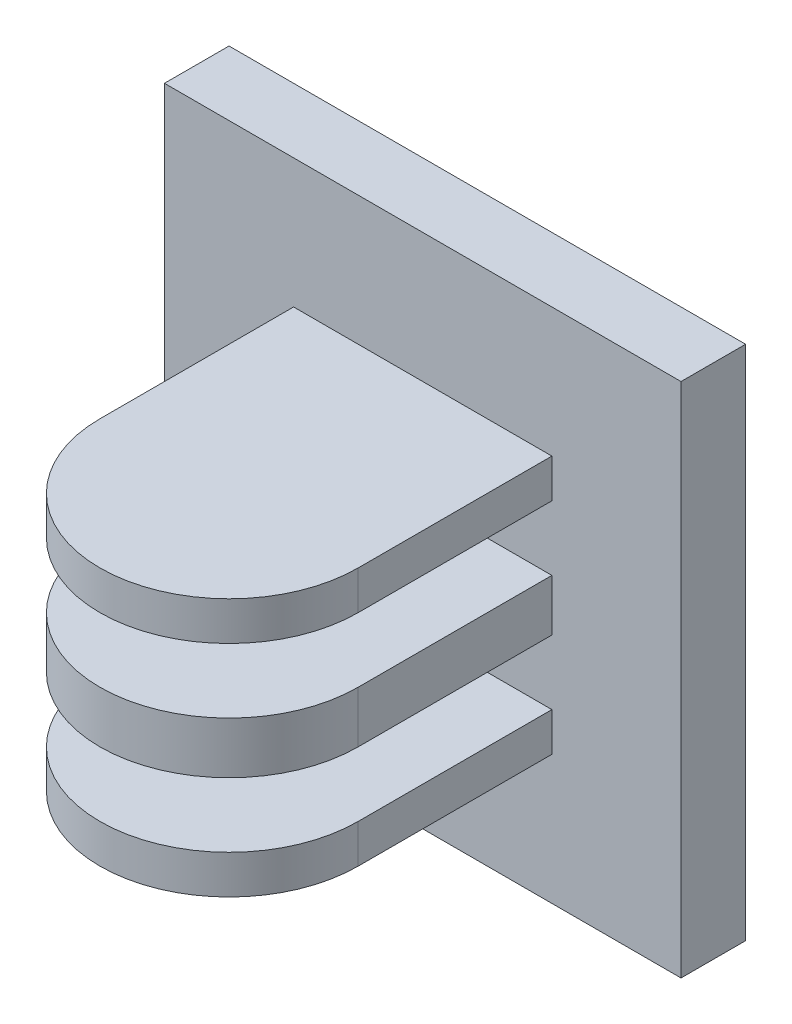
ISO-10303-21;
HEADER;
FILE_DESCRIPTION(('STEP AP214'),'2;1');
FILE_NAME('part.step','',(''),(''),'','','');
FILE_SCHEMA(('AUTOMOTIVE_DESIGN { 1 0 10303 214 1 1 1 1 }'));
ENDSEC;
DATA;
#1=APPLICATION_CONTEXT('core data for automotive mechanical design processes');
#2=APPLICATION_PROTOCOL_DEFINITION('international standard','automotive_design',2000,#1);
#3=PRODUCT_CONTEXT('',#1,'mechanical');
#4=PRODUCT('Part','Part','',(#3));
#5=PRODUCT_RELATED_PRODUCT_CATEGORY('part','',(#4));
#6=PRODUCT_DEFINITION_FORMATION('','',#4);
#7=PRODUCT_DEFINITION_CONTEXT('part definition',#1,'design');
#8=PRODUCT_DEFINITION('design','',#6,#7);
#9=PRODUCT_DEFINITION_SHAPE('','',#8);
#10=(LENGTH_UNIT() NAMED_UNIT(*) SI_UNIT(.MILLI.,.METRE.));
#11=(NAMED_UNIT(*) PLANE_ANGLE_UNIT() SI_UNIT($,.RADIAN.));
#12=(NAMED_UNIT(*) SI_UNIT($,.STERADIAN.) SOLID_ANGLE_UNIT());
#13=UNCERTAINTY_MEASURE_WITH_UNIT(LENGTH_MEASURE(1.E-05),#10,'distance_accuracy_value','');
#14=(GEOMETRIC_REPRESENTATION_CONTEXT(3) GLOBAL_UNCERTAINTY_ASSIGNED_CONTEXT((#13)) GLOBAL_UNIT_ASSIGNED_CONTEXT((#10,
#11,#12)) REPRESENTATION_CONTEXT('',''));
#15=CARTESIAN_POINT('',(0.,0.,0.));
#16=DIRECTION('',(0.,0.,1.));
#17=DIRECTION('',(1.,0.,0.));
#18=AXIS2_PLACEMENT_3D('',#15,#16,#17);
#19=CARTESIAN_POINT('',(10.,-10.,5.));
#20=DIRECTION('',(1.,0.,0.));
#21=DIRECTION('',(0.,0.,-1.));
#22=AXIS2_PLACEMENT_3D('',#19,#20,#21);
#23=PLANE('',#22);
#24=DIRECTION('',(0.,1.,0.));
#25=VECTOR('',#24,1.);
#26=CARTESIAN_POINT('',(10.,-10.,20.));
#27=LINE('',#26,#25);
#28=CARTESIAN_POINT('',(10.,-2.,20.));
#29=VERTEX_POINT('',#28);
#30=CARTESIAN_POINT('',(10.,2.,20.));
#31=VERTEX_POINT('',#30);
#32=EDGE_CURVE('E196',#29,#31,#27,.T.);
#33=ORIENTED_EDGE('',*,*,#32,.F.);
#34=DIRECTION('',(0.,0.,-1.));
#35=VECTOR('',#34,1.);
#36=CARTESIAN_POINT('',(10.,-2.,20.));
#37=LINE('',#36,#35);
#38=CARTESIAN_POINT('',(10.,-2.,5.));
#39=VERTEX_POINT('',#38);
#40=EDGE_CURVE('E305',#29,#39,#37,.T.);
#41=ORIENTED_EDGE('',*,*,#40,.T.);
#42=DIRECTION('',(0.,1.,0.));
#43=VECTOR('',#42,1.);
#44=CARTESIAN_POINT('',(10.,-10.,5.));
#45=LINE('',#44,#43);
#46=CARTESIAN_POINT('',(10.,2.,5.));
#47=VERTEX_POINT('',#46);
#48=EDGE_CURVE('E239',#39,#47,#45,.T.);
#49=ORIENTED_EDGE('',*,*,#48,.T.);
#50=DIRECTION('',(0.,0.,-1.));
#51=VECTOR('',#50,1.);
#52=CARTESIAN_POINT('',(10.,2.,20.));
#53=LINE('',#52,#51);
#54=EDGE_CURVE('E293',#31,#47,#53,.T.);
#55=ORIENTED_EDGE('',*,*,#54,.F.);
#56=EDGE_LOOP('',(#33,#41,#49,#55));
#57=FACE_BOUND('',#56,.T.);
#58=ADVANCED_FACE('F51',(#57),#23,.T.);
#59=CARTESIAN_POINT('',(0.,-10.,20.));
#60=DIRECTION('',(0.,1.,0.));
#61=DIRECTION('',(0.,0.,1.));
#62=AXIS2_PLACEMENT_3D('',#59,#60,#61);
#63=CYLINDRICAL_SURFACE('',#62,10.);
#64=DIRECTION('',(0.,1.,0.));
#65=VECTOR('',#64,1.);
#66=CARTESIAN_POINT('',(-10.,-10.,20.));
#67=LINE('',#66,#65);
#68=CARTESIAN_POINT('',(-10.,-2.,20.));
#69=VERTEX_POINT('',#68);
#70=CARTESIAN_POINT('',(-10.,2.,20.));
#71=VERTEX_POINT('',#70);
#72=EDGE_CURVE('E213',#69,#71,#67,.T.);
#73=ORIENTED_EDGE('',*,*,#72,.F.);
#74=CARTESIAN_POINT('',(0.,-2.,20.));
#75=DIRECTION('',(0.,1.,0.));
#76=DIRECTION('',(0.,0.,-1.));
#77=AXIS2_PLACEMENT_3D('',#74,#75,#76);
#78=CIRCLE('',#77,10.);
#79=EDGE_CURVE('E67',#69,#29,#78,.T.);
#80=ORIENTED_EDGE('',*,*,#79,.T.);
#81=ORIENTED_EDGE('',*,*,#32,.T.);
#82=CARTESIAN_POINT('',(0.,2.,20.));
#83=DIRECTION('',(0.,1.,0.));
#84=DIRECTION('',(0.,0.,-1.));
#85=AXIS2_PLACEMENT_3D('',#82,#83,#84);
#86=CIRCLE('',#85,10.);
#87=EDGE_CURVE('E277',#71,#31,#86,.T.);
#88=ORIENTED_EDGE('',*,*,#87,.F.);
#89=EDGE_LOOP('',(#73,#80,#81,#88));
#90=FACE_BOUND('',#89,.T.);
#91=ADVANCED_FACE('F380',(#90),#63,.T.);
#92=CARTESIAN_POINT('',(-10.,-10.,5.));
#93=DIRECTION('',(-1.,0.,0.));
#94=DIRECTION('',(0.,0.,1.));
#95=AXIS2_PLACEMENT_3D('',#92,#93,#94);
#96=PLANE('',#95);
#97=DIRECTION('',(0.,1.,0.));
#98=VECTOR('',#97,1.);
#99=CARTESIAN_POINT('',(-10.,-10.,5.));
#100=LINE('',#99,#98);
#101=CARTESIAN_POINT('',(-10.,-2.,5.));
#102=VERTEX_POINT('',#101);
#103=CARTESIAN_POINT('',(-10.,2.,5.));
#104=VERTEX_POINT('',#103);
#105=EDGE_CURVE('E227',#102,#104,#100,.T.);
#106=ORIENTED_EDGE('',*,*,#105,.F.);
#107=DIRECTION('',(0.,0.,1.));
#108=VECTOR('',#107,1.);
#109=CARTESIAN_POINT('',(-10.,-2.,5.));
#110=LINE('',#109,#108);
#111=EDGE_CURVE('E178',#102,#69,#110,.T.);
#112=ORIENTED_EDGE('',*,*,#111,.T.);
#113=ORIENTED_EDGE('',*,*,#72,.T.);
#114=DIRECTION('',(0.,0.,1.));
#115=VECTOR('',#114,1.);
#116=CARTESIAN_POINT('',(-10.,2.,5.));
#117=LINE('',#116,#115);
#118=EDGE_CURVE('E260',#104,#71,#117,.T.);
#119=ORIENTED_EDGE('',*,*,#118,.F.);
#120=EDGE_LOOP('',(#106,#112,#113,#119));
#121=FACE_BOUND('',#120,.T.);
#122=ADVANCED_FACE('F387',(#121),#96,.T.);
#123=CARTESIAN_POINT('',(10.,7.,20.));
#124=VERTEX_POINT('',#123);
#125=CARTESIAN_POINT('',(10.,10.,20.));
#126=VERTEX_POINT('',#125);
#127=EDGE_CURVE('E198',#124,#126,#27,.T.);
#128=ORIENTED_EDGE('',*,*,#127,.F.);
#129=DIRECTION('',(0.,0.,-1.));
#130=VECTOR('',#129,1.);
#131=CARTESIAN_POINT('',(10.,7.,20.));
#132=LINE('',#131,#130);
#133=CARTESIAN_POINT('',(10.,7.,5.));
#134=VERTEX_POINT('',#133);
#135=EDGE_CURVE('E281',#124,#134,#132,.T.);
#136=ORIENTED_EDGE('',*,*,#135,.T.);
#137=CARTESIAN_POINT('',(10.,10.,5.));
#138=VERTEX_POINT('',#137);
#139=EDGE_CURVE('E240',#134,#138,#45,.T.);
#140=ORIENTED_EDGE('',*,*,#139,.T.);
#141=DIRECTION('',(0.,0.,-1.));
#142=VECTOR('',#141,1.);
#143=CARTESIAN_POINT('',(10.,10.,5.));
#144=LINE('',#143,#142);
#145=EDGE_CURVE('E256',#126,#138,#144,.T.);
#146=ORIENTED_EDGE('',*,*,#145,.F.);
#147=EDGE_LOOP('',(#128,#136,#140,#146));
#148=FACE_BOUND('',#147,.T.);
#149=ADVANCED_FACE('F383',(#148),#23,.T.);
#150=CARTESIAN_POINT('',(-10.,7.,20.));
#151=VERTEX_POINT('',#150);
#152=CARTESIAN_POINT('',(-10.,10.,20.));
#153=VERTEX_POINT('',#152);
#154=EDGE_CURVE('E214',#151,#153,#67,.T.);
#155=ORIENTED_EDGE('',*,*,#154,.F.);
#156=CARTESIAN_POINT('',(0.,7.,20.));
#157=DIRECTION('',(0.,1.,0.));
#158=DIRECTION('',(0.,0.,-1.));
#159=AXIS2_PLACEMENT_3D('',#156,#157,#158);
#160=CIRCLE('',#159,10.);
#161=EDGE_CURVE('E75',#151,#124,#160,.T.);
#162=ORIENTED_EDGE('',*,*,#161,.T.);
#163=ORIENTED_EDGE('',*,*,#127,.T.);
#164=CARTESIAN_POINT('',(0.,10.,20.));
#165=DIRECTION('',(0.,1.,0.));
#166=DIRECTION('',(0.,0.,1.));
#167=AXIS2_PLACEMENT_3D('',#164,#165,#166);
#168=CIRCLE('',#167,10.);
#169=EDGE_CURVE('E265',#153,#126,#168,.T.);
#170=ORIENTED_EDGE('',*,*,#169,.F.);
#171=EDGE_LOOP('',(#155,#162,#163,#170));
#172=FACE_BOUND('',#171,.T.);
#173=ADVANCED_FACE('F390',(#172),#63,.T.);
#174=CARTESIAN_POINT('',(-10.,7.,5.));
#175=VERTEX_POINT('',#174);
#176=CARTESIAN_POINT('',(-10.,10.,5.));
#177=VERTEX_POINT('',#176);
#178=EDGE_CURVE('E228',#175,#177,#100,.T.);
#179=ORIENTED_EDGE('',*,*,#178,.F.);
#180=DIRECTION('',(0.,0.,1.));
#181=VECTOR('',#180,1.);
#182=CARTESIAN_POINT('',(-10.,7.,5.));
#183=LINE('',#182,#181);
#184=EDGE_CURVE('E274',#175,#151,#183,.T.);
#185=ORIENTED_EDGE('',*,*,#184,.T.);
#186=ORIENTED_EDGE('',*,*,#154,.T.);
#187=DIRECTION('',(0.,0.,1.));
#188=VECTOR('',#187,1.);
#189=CARTESIAN_POINT('',(-10.,10.,5.));
#190=LINE('',#189,#188);
#191=EDGE_CURVE('E263',#177,#153,#190,.T.);
#192=ORIENTED_EDGE('',*,*,#191,.F.);
#193=EDGE_LOOP('',(#179,#185,#186,#192));
#194=FACE_BOUND('',#193,.T.);
#195=ADVANCED_FACE('F433',(#194),#96,.T.);
#196=CARTESIAN_POINT('',(-20.,20.,5.));
#197=DIRECTION('',(1.,0.,0.));
#198=DIRECTION('',(0.,1.,0.));
#199=AXIS2_PLACEMENT_3D('',#196,#197,#198);
#200=PLANE('',#199);
#201=DIRECTION('',(0.,-1.,0.));
#202=VECTOR('',#201,1.);
#203=CARTESIAN_POINT('',(-20.,20.,0.));
#204=LINE('',#203,#202);
#205=CARTESIAN_POINT('',(-20.,20.,0.));
#206=VERTEX_POINT('',#205);
#207=CARTESIAN_POINT('',(-20.,-20.,0.));
#208=VERTEX_POINT('',#207);
#209=EDGE_CURVE('E195',#206,#208,#204,.T.);
#210=ORIENTED_EDGE('',*,*,#209,.T.);
#211=DIRECTION('',(0.,0.,-1.));
#212=VECTOR('',#211,1.);
#213=CARTESIAN_POINT('',(-20.,-20.,5.));
#214=LINE('',#213,#212);
#215=CARTESIAN_POINT('',(-20.,-20.,5.));
#216=VERTEX_POINT('',#215);
#217=EDGE_CURVE('E13',#216,#208,#214,.T.);
#218=ORIENTED_EDGE('',*,*,#217,.F.);
#219=DIRECTION('',(0.,-1.,0.));
#220=VECTOR('',#219,1.);
#221=CARTESIAN_POINT('',(-20.,20.,5.));
#222=LINE('',#221,#220);
#223=CARTESIAN_POINT('',(-20.,20.,5.));
#224=VERTEX_POINT('',#223);
#225=EDGE_CURVE('E327',#224,#216,#222,.T.);
#226=ORIENTED_EDGE('',*,*,#225,.F.);
#227=DIRECTION('',(0.,0.,-1.));
#228=VECTOR('',#227,1.);
#229=CARTESIAN_POINT('',(-20.,20.,5.));
#230=LINE('',#229,#228);
#231=EDGE_CURVE('E350',#224,#206,#230,.T.);
#232=ORIENTED_EDGE('',*,*,#231,.T.);
#233=EDGE_LOOP('',(#210,#218,#226,#232));
#234=FACE_BOUND('',#233,.T.);
#235=ADVANCED_FACE('F53',(#234),#200,.F.);
#236=CARTESIAN_POINT('',(-20.,-20.,5.));
#237=DIRECTION('',(0.,1.,0.));
#238=DIRECTION('',(0.,0.,1.));
#239=AXIS2_PLACEMENT_3D('',#236,#237,#238);
#240=PLANE('',#239);
#241=DIRECTION('',(1.,0.,0.));
#242=VECTOR('',#241,1.);
#243=CARTESIAN_POINT('',(-20.,-20.,0.));
#244=LINE('',#243,#242);
#245=CARTESIAN_POINT('',(20.,-20.,0.));
#246=VERTEX_POINT('',#245);
#247=EDGE_CURVE('E202',#208,#246,#244,.T.);
#248=ORIENTED_EDGE('',*,*,#247,.T.);
#249=DIRECTION('',(0.,0.,-1.));
#250=VECTOR('',#249,1.);
#251=CARTESIAN_POINT('',(20.,-20.,5.));
#252=LINE('',#251,#250);
#253=CARTESIAN_POINT('',(20.,-20.,5.));
#254=VERTEX_POINT('',#253);
#255=EDGE_CURVE('E60',#254,#246,#252,.T.);
#256=ORIENTED_EDGE('',*,*,#255,.F.);
#257=DIRECTION('',(1.,0.,0.));
#258=VECTOR('',#257,1.);
#259=CARTESIAN_POINT('',(-20.,-20.,5.));
#260=LINE('',#259,#258);
#261=EDGE_CURVE('E329',#216,#254,#260,.T.);
#262=ORIENTED_EDGE('',*,*,#261,.F.);
#263=ORIENTED_EDGE('',*,*,#217,.T.);
#264=EDGE_LOOP('',(#248,#256,#262,#263));
#265=FACE_BOUND('',#264,.T.);
#266=ADVANCED_FACE('F340',(#265),#240,.F.);
#267=CARTESIAN_POINT('',(20.,20.,5.));
#268=DIRECTION('',(-1.,0.,0.));
#269=DIRECTION('',(0.,0.,1.));
#270=AXIS2_PLACEMENT_3D('',#267,#268,#269);
#271=PLANE('',#270);
#272=DIRECTION('',(0.,1.,0.));
#273=VECTOR('',#272,1.);
#274=CARTESIAN_POINT('',(20.,20.,0.));
#275=LINE('',#274,#273);
#276=CARTESIAN_POINT('',(20.,20.,0.));
#277=VERTEX_POINT('',#276);
#278=EDGE_CURVE('E354',#246,#277,#275,.T.);
#279=ORIENTED_EDGE('',*,*,#278,.T.);
#280=DIRECTION('',(0.,0.,-1.));
#281=VECTOR('',#280,1.);
#282=CARTESIAN_POINT('',(20.,20.,5.));
#283=LINE('',#282,#281);
#284=CARTESIAN_POINT('',(20.,20.,5.));
#285=VERTEX_POINT('',#284);
#286=EDGE_CURVE('E361',#285,#277,#283,.T.);
#287=ORIENTED_EDGE('',*,*,#286,.F.);
#288=DIRECTION('',(0.,1.,0.));
#289=VECTOR('',#288,1.);
#290=CARTESIAN_POINT('',(20.,20.,5.));
#291=LINE('',#290,#289);
#292=EDGE_CURVE('E344',#254,#285,#291,.T.);
#293=ORIENTED_EDGE('',*,*,#292,.F.);
#294=ORIENTED_EDGE('',*,*,#255,.T.);
#295=EDGE_LOOP('',(#279,#287,#293,#294));
#296=FACE_BOUND('',#295,.T.);
#297=ADVANCED_FACE('F367',(#296),#271,.F.);
#298=CARTESIAN_POINT('',(-20.,20.,5.));
#299=DIRECTION('',(0.,-1.,0.));
#300=DIRECTION('',(0.,0.,-1.));
#301=AXIS2_PLACEMENT_3D('',#298,#299,#300);
#302=PLANE('',#301);
#303=DIRECTION('',(-1.,0.,0.));
#304=VECTOR('',#303,1.);
#305=CARTESIAN_POINT('',(-20.,20.,0.));
#306=LINE('',#305,#304);
#307=EDGE_CURVE('E337',#277,#206,#306,.T.);
#308=ORIENTED_EDGE('',*,*,#307,.T.);
#309=ORIENTED_EDGE('',*,*,#231,.F.);
#310=DIRECTION('',(-1.,0.,0.));
#311=VECTOR('',#310,1.);
#312=CARTESIAN_POINT('',(-20.,20.,5.));
#313=LINE('',#312,#311);
#314=EDGE_CURVE('E332',#285,#224,#313,.T.);
#315=ORIENTED_EDGE('',*,*,#314,.F.);
#316=ORIENTED_EDGE('',*,*,#286,.T.);
#317=EDGE_LOOP('',(#308,#309,#315,#316));
#318=FACE_BOUND('',#317,.T.);
#319=ADVANCED_FACE('F322',(#318),#302,.F.);
#320=CARTESIAN_POINT('',(0.,0.,5.));
#321=DIRECTION('',(0.,0.,1.));
#322=DIRECTION('',(1.,0.,0.));
#323=AXIS2_PLACEMENT_3D('',#320,#321,#322);
#324=PLANE('',#323);
#325=ORIENTED_EDGE('',*,*,#48,.F.);
#326=DIRECTION('',(-1.,0.,0.));
#327=VECTOR('',#326,1.);
#328=CARTESIAN_POINT('',(10.,-2.,5.));
#329=LINE('',#328,#327);
#330=EDGE_CURVE('E302',#39,#102,#329,.T.);
#331=ORIENTED_EDGE('',*,*,#330,.T.);
#332=ORIENTED_EDGE('',*,*,#105,.T.);
#333=DIRECTION('',(-1.,0.,0.));
#334=VECTOR('',#333,1.);
#335=CARTESIAN_POINT('',(10.,2.,5.));
#336=LINE('',#335,#334);
#337=EDGE_CURVE('E289',#47,#104,#336,.T.);
#338=ORIENTED_EDGE('',*,*,#337,.F.);
#339=EDGE_LOOP('',(#325,#331,#332,#338));
#340=FACE_BOUND('',#339,.T.);
#341=ORIENTED_EDGE('',*,*,#139,.F.);
#342=DIRECTION('',(-1.,0.,0.));
#343=VECTOR('',#342,1.);
#344=CARTESIAN_POINT('',(10.,7.,5.));
#345=LINE('',#344,#343);
#346=EDGE_CURVE('E278',#134,#175,#345,.T.);
#347=ORIENTED_EDGE('',*,*,#346,.T.);
#348=ORIENTED_EDGE('',*,*,#178,.T.);
#349=DIRECTION('',(-1.,0.,0.));
#350=VECTOR('',#349,1.);
#351=CARTESIAN_POINT('',(10.,10.,5.));
#352=LINE('',#351,#350);
#353=EDGE_CURVE('E259',#138,#177,#352,.T.);
#354=ORIENTED_EDGE('',*,*,#353,.F.);
#355=EDGE_LOOP('',(#341,#347,#348,#354));
#356=FACE_BOUND('',#355,.T.);
#357=DIRECTION('',(-1.,0.,0.));
#358=VECTOR('',#357,1.);
#359=CARTESIAN_POINT('',(10.,-7.,5.));
#360=LINE('',#359,#358);
#361=CARTESIAN_POINT('',(10.,-7.,5.));
#362=VERTEX_POINT('',#361);
#363=CARTESIAN_POINT('',(-10.,-7.,5.));
#364=VERTEX_POINT('',#363);
#365=EDGE_CURVE('E188',#362,#364,#360,.T.);
#366=ORIENTED_EDGE('',*,*,#365,.F.);
#367=CARTESIAN_POINT('',(10.,-10.,5.));
#368=VERTEX_POINT('',#367);
#369=EDGE_CURVE('E186',#368,#362,#45,.T.);
#370=ORIENTED_EDGE('',*,*,#369,.F.);
#371=DIRECTION('',(-1.,0.,0.));
#372=VECTOR('',#371,1.);
#373=CARTESIAN_POINT('',(10.,-10.,5.));
#374=LINE('',#373,#372);
#375=CARTESIAN_POINT('',(-10.,-10.,5.));
#376=VERTEX_POINT('',#375);
#377=EDGE_CURVE('E252',#368,#376,#374,.T.);
#378=ORIENTED_EDGE('',*,*,#377,.T.);
#379=EDGE_CURVE('E220',#376,#364,#100,.T.);
#380=ORIENTED_EDGE('',*,*,#379,.T.);
#381=EDGE_LOOP('',(#366,#370,#378,#380));
#382=FACE_BOUND('',#381,.T.);
#383=ORIENTED_EDGE('',*,*,#225,.T.);
#384=ORIENTED_EDGE('',*,*,#261,.T.);
#385=ORIENTED_EDGE('',*,*,#292,.T.);
#386=ORIENTED_EDGE('',*,*,#314,.T.);
#387=EDGE_LOOP('',(#383,#384,#385,#386));
#388=FACE_BOUND('',#387,.T.);
#389=ADVANCED_FACE('F318',(#340,#356,#382,#388),#324,.T.);
#390=CARTESIAN_POINT('',(0.,0.,0.));
#391=DIRECTION('',(0.,0.,1.));
#392=DIRECTION('',(1.,0.,0.));
#393=AXIS2_PLACEMENT_3D('',#390,#391,#392);
#394=PLANE('',#393);
#395=ORIENTED_EDGE('',*,*,#209,.F.);
#396=ORIENTED_EDGE('',*,*,#307,.F.);
#397=ORIENTED_EDGE('',*,*,#278,.F.);
#398=ORIENTED_EDGE('',*,*,#247,.F.);
#399=EDGE_LOOP('',(#395,#396,#397,#398));
#400=FACE_BOUND('',#399,.T.);
#401=ADVANCED_FACE('F321',(#400),#394,.F.);
#402=DIRECTION('',(0.,0.,-1.));
#403=VECTOR('',#402,1.);
#404=CARTESIAN_POINT('',(10.,-7.,20.));
#405=LINE('',#404,#403);
#406=CARTESIAN_POINT('',(10.,-7.,20.));
#407=VERTEX_POINT('',#406);
#408=EDGE_CURVE('E170',#407,#362,#405,.T.);
#409=ORIENTED_EDGE('',*,*,#408,.F.);
#410=CARTESIAN_POINT('',(10.,-10.,20.));
#411=VERTEX_POINT('',#410);
#412=EDGE_CURVE('E183',#411,#407,#27,.T.);
#413=ORIENTED_EDGE('',*,*,#412,.F.);
#414=DIRECTION('',(0.,0.,-1.));
#415=VECTOR('',#414,1.);
#416=CARTESIAN_POINT('',(10.,-10.,5.));
#417=LINE('',#416,#415);
#418=EDGE_CURVE('E268',#411,#368,#417,.T.);
#419=ORIENTED_EDGE('',*,*,#418,.T.);
#420=ORIENTED_EDGE('',*,*,#369,.T.);
#421=EDGE_LOOP('',(#409,#413,#419,#420));
#422=FACE_BOUND('',#421,.T.);
#423=ADVANCED_FACE('F181',(#422),#23,.T.);
#424=CARTESIAN_POINT('',(0.,-7.,20.));
#425=DIRECTION('',(0.,1.,0.));
#426=DIRECTION('',(0.,0.,-1.));
#427=AXIS2_PLACEMENT_3D('',#424,#425,#426);
#428=CIRCLE('',#427,10.);
#429=CARTESIAN_POINT('',(-10.,-7.,20.));
#430=VERTEX_POINT('',#429);
#431=EDGE_CURVE('E167',#430,#407,#428,.T.);
#432=ORIENTED_EDGE('',*,*,#431,.F.);
#433=CARTESIAN_POINT('',(-10.,-10.,20.));
#434=VERTEX_POINT('',#433);
#435=EDGE_CURVE('E207',#434,#430,#67,.T.);
#436=ORIENTED_EDGE('',*,*,#435,.F.);
#437=CARTESIAN_POINT('',(0.,-10.,20.));
#438=DIRECTION('',(0.,1.,0.));
#439=DIRECTION('',(0.,0.,1.));
#440=AXIS2_PLACEMENT_3D('',#437,#438,#439);
#441=CIRCLE('',#440,10.);
#442=EDGE_CURVE('E193',#434,#411,#441,.T.);
#443=ORIENTED_EDGE('',*,*,#442,.T.);
#444=ORIENTED_EDGE('',*,*,#412,.T.);
#445=EDGE_LOOP('',(#432,#436,#443,#444));
#446=FACE_BOUND('',#445,.T.);
#447=ADVANCED_FACE('F191',(#446),#63,.T.);
#448=DIRECTION('',(0.,0.,1.));
#449=VECTOR('',#448,1.);
#450=CARTESIAN_POINT('',(-10.,-7.,5.));
#451=LINE('',#450,#449);
#452=EDGE_CURVE('E173',#364,#430,#451,.T.);
#453=ORIENTED_EDGE('',*,*,#452,.F.);
#454=ORIENTED_EDGE('',*,*,#379,.F.);
#455=DIRECTION('',(0.,0.,1.));
#456=VECTOR('',#455,1.);
#457=CARTESIAN_POINT('',(-10.,-10.,5.));
#458=LINE('',#457,#456);
#459=EDGE_CURVE('E249',#376,#434,#458,.T.);
#460=ORIENTED_EDGE('',*,*,#459,.T.);
#461=ORIENTED_EDGE('',*,*,#435,.T.);
#462=EDGE_LOOP('',(#453,#454,#460,#461));
#463=FACE_BOUND('',#462,.T.);
#464=ADVANCED_FACE('F314',(#463),#96,.T.);
#465=CARTESIAN_POINT('',(0.,-10.,20.));
#466=DIRECTION('',(0.,1.,0.));
#467=DIRECTION('',(0.,0.,1.));
#468=AXIS2_PLACEMENT_3D('',#465,#466,#467);
#469=PLANE('',#468);
#470=ORIENTED_EDGE('',*,*,#418,.F.);
#471=ORIENTED_EDGE('',*,*,#442,.F.);
#472=ORIENTED_EDGE('',*,*,#459,.F.);
#473=ORIENTED_EDGE('',*,*,#377,.F.);
#474=EDGE_LOOP('',(#470,#471,#472,#473));
#475=FACE_BOUND('',#474,.T.);
#476=ADVANCED_FACE('F317',(#475),#469,.F.);
#477=CARTESIAN_POINT('',(0.,10.,20.));
#478=DIRECTION('',(0.,1.,0.));
#479=DIRECTION('',(0.,0.,1.));
#480=AXIS2_PLACEMENT_3D('',#477,#478,#479);
#481=PLANE('',#480);
#482=ORIENTED_EDGE('',*,*,#145,.T.);
#483=ORIENTED_EDGE('',*,*,#353,.T.);
#484=ORIENTED_EDGE('',*,*,#191,.T.);
#485=ORIENTED_EDGE('',*,*,#169,.T.);
#486=EDGE_LOOP('',(#482,#483,#484,#485));
#487=FACE_BOUND('',#486,.T.);
#488=ADVANCED_FACE('F460',(#487),#481,.T.);
#489=CARTESIAN_POINT('',(0.,2.,20.));
#490=DIRECTION('',(0.,-1.,0.));
#491=DIRECTION('',(0.,0.,-1.));
#492=AXIS2_PLACEMENT_3D('',#489,#490,#491);
#493=PLANE('',#492);
#494=ORIENTED_EDGE('',*,*,#87,.T.);
#495=ORIENTED_EDGE('',*,*,#54,.T.);
#496=ORIENTED_EDGE('',*,*,#337,.T.);
#497=ORIENTED_EDGE('',*,*,#118,.T.);
#498=EDGE_LOOP('',(#494,#495,#496,#497));
#499=FACE_BOUND('',#498,.T.);
#500=ADVANCED_FACE('F457',(#499),#493,.F.);
#501=CARTESIAN_POINT('',(0.,7.,20.));
#502=DIRECTION('',(0.,-1.,0.));
#503=DIRECTION('',(0.,0.,-1.));
#504=AXIS2_PLACEMENT_3D('',#501,#502,#503);
#505=PLANE('',#504);
#506=ORIENTED_EDGE('',*,*,#161,.F.);
#507=ORIENTED_EDGE('',*,*,#184,.F.);
#508=ORIENTED_EDGE('',*,*,#346,.F.);
#509=ORIENTED_EDGE('',*,*,#135,.F.);
#510=EDGE_LOOP('',(#506,#507,#508,#509));
#511=FACE_BOUND('',#510,.T.);
#512=ADVANCED_FACE('F443',(#511),#505,.T.);
#513=CARTESIAN_POINT('',(0.,-7.,20.));
#514=DIRECTION('',(0.,-1.,0.));
#515=DIRECTION('',(0.,0.,-1.));
#516=AXIS2_PLACEMENT_3D('',#513,#514,#515);
#517=PLANE('',#516);
#518=ORIENTED_EDGE('',*,*,#431,.T.);
#519=ORIENTED_EDGE('',*,*,#408,.T.);
#520=ORIENTED_EDGE('',*,*,#365,.T.);
#521=ORIENTED_EDGE('',*,*,#452,.T.);
#522=EDGE_LOOP('',(#518,#519,#520,#521));
#523=FACE_BOUND('',#522,.T.);
#524=ADVANCED_FACE('F169',(#523),#517,.F.);
#525=CARTESIAN_POINT('',(0.,-2.,20.));
#526=DIRECTION('',(0.,-1.,0.));
#527=DIRECTION('',(0.,0.,-1.));
#528=AXIS2_PLACEMENT_3D('',#525,#526,#527);
#529=PLANE('',#528);
#530=ORIENTED_EDGE('',*,*,#79,.F.);
#531=ORIENTED_EDGE('',*,*,#111,.F.);
#532=ORIENTED_EDGE('',*,*,#330,.F.);
#533=ORIENTED_EDGE('',*,*,#40,.F.);
#534=EDGE_LOOP('',(#530,#531,#532,#533));
#535=FACE_BOUND('',#534,.T.);
#536=ADVANCED_FACE('F442',(#535),#529,.T.);
#537=CLOSED_SHELL('',(#58,#91,#122,#149,#173,#195,#235,#266,#297,#319,#389,#401,#423,#447,#464,
#476,#488,#500,#512,#524,#536));
#538=MANIFOLD_SOLID_BREP('B2',#537);
#539=ADVANCED_BREP_SHAPE_REPRESENTATION('',(#18,#538),#14);
#540=SHAPE_DEFINITION_REPRESENTATION(#9,#539);
ENDSEC;
END-ISO-10303-21;
